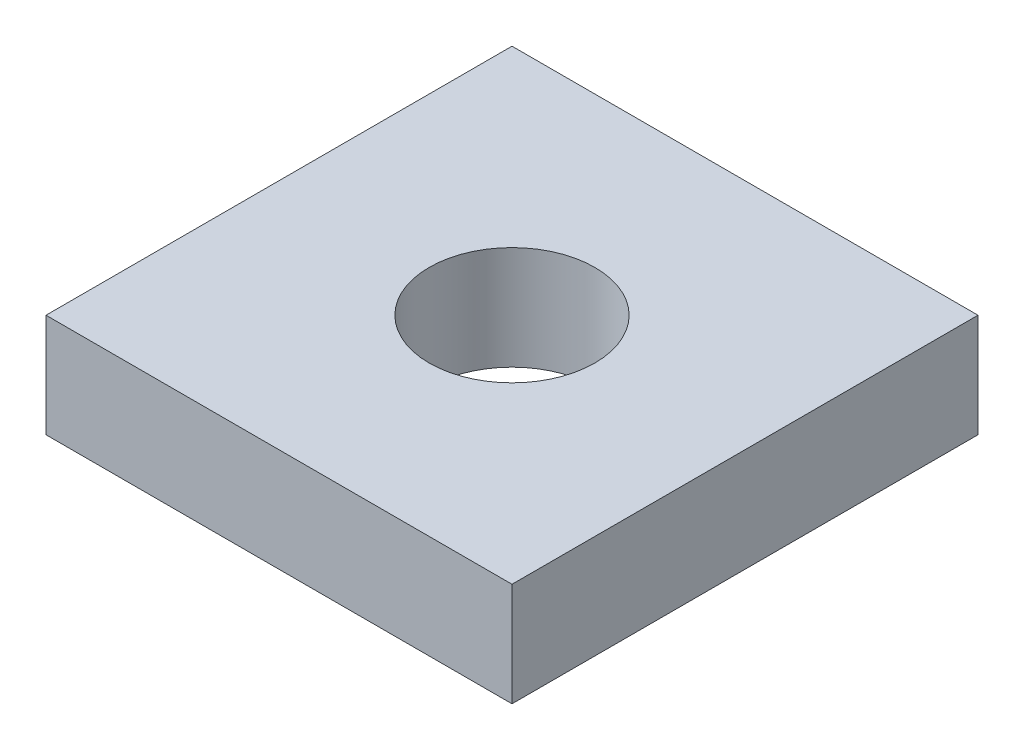
ISO-10303-21;
HEADER;
FILE_DESCRIPTION(('STEP AP214'),'2;1');
FILE_NAME('part.step','',(''),(''),'','','');
FILE_SCHEMA(('AUTOMOTIVE_DESIGN { 1 0 10303 214 1 1 1 1 }'));
ENDSEC;
DATA;
#1=APPLICATION_CONTEXT('core data for automotive mechanical design processes');
#2=APPLICATION_PROTOCOL_DEFINITION('international standard','automotive_design',2000,#1);
#3=PRODUCT_CONTEXT('',#1,'mechanical');
#4=PRODUCT('Part','Part','',(#3));
#5=PRODUCT_RELATED_PRODUCT_CATEGORY('part','',(#4));
#6=PRODUCT_DEFINITION_FORMATION('','',#4);
#7=PRODUCT_DEFINITION_CONTEXT('part definition',#1,'design');
#8=PRODUCT_DEFINITION('design','',#6,#7);
#9=PRODUCT_DEFINITION_SHAPE('','',#8);
#10=(LENGTH_UNIT() NAMED_UNIT(*) SI_UNIT(.MILLI.,.METRE.));
#11=(NAMED_UNIT(*) PLANE_ANGLE_UNIT() SI_UNIT($,.RADIAN.));
#12=(NAMED_UNIT(*) SI_UNIT($,.STERADIAN.) SOLID_ANGLE_UNIT());
#13=UNCERTAINTY_MEASURE_WITH_UNIT(LENGTH_MEASURE(1.E-05),#10,'distance_accuracy_value','');
#14=(GEOMETRIC_REPRESENTATION_CONTEXT(3) GLOBAL_UNCERTAINTY_ASSIGNED_CONTEXT((#13)) GLOBAL_UNIT_ASSIGNED_CONTEXT((#10,
#11,#12)) REPRESENTATION_CONTEXT('',''));
#15=CARTESIAN_POINT('',(0.,0.,0.));
#16=DIRECTION('',(0.,0.,1.));
#17=DIRECTION('',(1.,0.,0.));
#18=AXIS2_PLACEMENT_3D('',#15,#16,#17);
#19=CARTESIAN_POINT('',(0.,10.,0.));
#20=DIRECTION('',(0.,-1.,0.));
#21=DIRECTION('',(0.,0.,-1.));
#22=AXIS2_PLACEMENT_3D('',#19,#20,#21);
#23=PLANE('',#22);
#24=DIRECTION('',(0.,0.,1.));
#25=VECTOR('',#24,1.);
#26=CARTESIAN_POINT('',(0.,10.,0.));
#27=LINE('',#26,#25);
#28=CARTESIAN_POINT('',(0.,10.,-45.));
#29=VERTEX_POINT('',#28);
#30=CARTESIAN_POINT('',(0.,10.,0.));
#31=VERTEX_POINT('',#30);
#32=EDGE_CURVE('E84',#29,#31,#27,.T.);
#33=ORIENTED_EDGE('',*,*,#32,.T.);
#34=DIRECTION('',(1.,0.,0.));
#35=VECTOR('',#34,1.);
#36=CARTESIAN_POINT('',(0.,10.,0.));
#37=LINE('',#36,#35);
#38=CARTESIAN_POINT('',(45.,10.,0.));
#39=VERTEX_POINT('',#38);
#40=EDGE_CURVE('E79',#31,#39,#37,.T.);
#41=ORIENTED_EDGE('',*,*,#40,.T.);
#42=DIRECTION('',(0.,0.,-1.));
#43=VECTOR('',#42,1.);
#44=CARTESIAN_POINT('',(45.,10.,0.));
#45=LINE('',#44,#43);
#46=CARTESIAN_POINT('',(45.,10.,-45.));
#47=VERTEX_POINT('',#46);
#48=EDGE_CURVE('E82',#39,#47,#45,.T.);
#49=ORIENTED_EDGE('',*,*,#48,.T.);
#50=DIRECTION('',(-1.,0.,0.));
#51=VECTOR('',#50,1.);
#52=CARTESIAN_POINT('',(0.,10.,-45.));
#53=LINE('',#52,#51);
#54=EDGE_CURVE('E49',#47,#29,#53,.T.);
#55=ORIENTED_EDGE('',*,*,#54,.T.);
#56=EDGE_LOOP('',(#33,#41,#49,#55));
#57=FACE_BOUND('',#56,.T.);
#58=CARTESIAN_POINT('',(22.5,10.,-22.5));
#59=DIRECTION('',(0.,1.,0.));
#60=DIRECTION('',(0.,0.,1.));
#61=AXIS2_PLACEMENT_3D('',#58,#59,#60);
#62=CIRCLE('',#61,8.);
#63=CARTESIAN_POINT('',(22.5,10.,-14.5));
#64=VERTEX_POINT('',#63);
#65=EDGE_CURVE('E99',#64,#64,#62,.T.);
#66=ORIENTED_EDGE('',*,*,#65,.F.);
#67=EDGE_LOOP('',(#66));
#68=FACE_BOUND('',#67,.T.);
#69=ADVANCED_FACE('F32',(#57,#68),#23,.F.);
#70=CARTESIAN_POINT('',(0.,0.,0.));
#71=DIRECTION('',(0.,-1.,0.));
#72=DIRECTION('',(0.,0.,-1.));
#73=AXIS2_PLACEMENT_3D('',#70,#71,#72);
#74=PLANE('',#73);
#75=DIRECTION('',(0.,0.,1.));
#76=VECTOR('',#75,1.);
#77=CARTESIAN_POINT('',(0.,0.,0.));
#78=LINE('',#77,#76);
#79=CARTESIAN_POINT('',(0.,0.,-45.));
#80=VERTEX_POINT('',#79);
#81=CARTESIAN_POINT('',(0.,0.,0.));
#82=VERTEX_POINT('',#81);
#83=EDGE_CURVE('E96',#80,#82,#78,.T.);
#84=ORIENTED_EDGE('',*,*,#83,.F.);
#85=DIRECTION('',(-1.,0.,0.));
#86=VECTOR('',#85,1.);
#87=CARTESIAN_POINT('',(0.,0.,-45.));
#88=LINE('',#87,#86);
#89=CARTESIAN_POINT('',(45.,0.,-45.));
#90=VERTEX_POINT('',#89);
#91=EDGE_CURVE('E72',#90,#80,#88,.T.);
#92=ORIENTED_EDGE('',*,*,#91,.F.);
#93=DIRECTION('',(0.,0.,-1.));
#94=VECTOR('',#93,1.);
#95=CARTESIAN_POINT('',(45.,0.,0.));
#96=LINE('',#95,#94);
#97=CARTESIAN_POINT('',(45.,0.,0.));
#98=VERTEX_POINT('',#97);
#99=EDGE_CURVE('E66',#98,#90,#96,.T.);
#100=ORIENTED_EDGE('',*,*,#99,.F.);
#101=DIRECTION('',(1.,0.,0.));
#102=VECTOR('',#101,1.);
#103=CARTESIAN_POINT('',(0.,0.,0.));
#104=LINE('',#103,#102);
#105=EDGE_CURVE('E88',#82,#98,#104,.T.);
#106=ORIENTED_EDGE('',*,*,#105,.F.);
#107=EDGE_LOOP('',(#84,#92,#100,#106));
#108=FACE_BOUND('',#107,.T.);
#109=CARTESIAN_POINT('',(22.5,0.,-22.5));
#110=DIRECTION('',(0.,1.,0.));
#111=DIRECTION('',(0.,0.,1.));
#112=AXIS2_PLACEMENT_3D('',#109,#110,#111);
#113=CIRCLE('',#112,8.);
#114=CARTESIAN_POINT('',(22.5,0.,-14.5));
#115=VERTEX_POINT('',#114);
#116=EDGE_CURVE('E111',#115,#115,#113,.T.);
#117=ORIENTED_EDGE('',*,*,#116,.T.);
#118=EDGE_LOOP('',(#117));
#119=FACE_BOUND('',#118,.T.);
#120=ADVANCED_FACE('F107',(#108,#119),#74,.T.);
#121=CARTESIAN_POINT('',(0.,10.,0.));
#122=DIRECTION('',(1.,0.,0.));
#123=DIRECTION('',(0.,0.,-1.));
#124=AXIS2_PLACEMENT_3D('',#121,#122,#123);
#125=PLANE('',#124);
#126=ORIENTED_EDGE('',*,*,#83,.T.);
#127=DIRECTION('',(0.,-1.,0.));
#128=VECTOR('',#127,1.);
#129=CARTESIAN_POINT('',(0.,10.,0.));
#130=LINE('',#129,#128);
#131=EDGE_CURVE('E11',#31,#82,#130,.T.);
#132=ORIENTED_EDGE('',*,*,#131,.F.);
#133=ORIENTED_EDGE('',*,*,#32,.F.);
#134=DIRECTION('',(0.,-1.,0.));
#135=VECTOR('',#134,1.);
#136=CARTESIAN_POINT('',(0.,10.,-45.));
#137=LINE('',#136,#135);
#138=EDGE_CURVE('E92',#29,#80,#137,.T.);
#139=ORIENTED_EDGE('',*,*,#138,.T.);
#140=EDGE_LOOP('',(#126,#132,#133,#139));
#141=FACE_BOUND('',#140,.T.);
#142=ADVANCED_FACE('F34',(#141),#125,.F.);
#143=CARTESIAN_POINT('',(0.,10.,0.));
#144=DIRECTION('',(0.,0.,-1.));
#145=DIRECTION('',(-1.,0.,0.));
#146=AXIS2_PLACEMENT_3D('',#143,#144,#145);
#147=PLANE('',#146);
#148=ORIENTED_EDGE('',*,*,#105,.T.);
#149=DIRECTION('',(0.,-1.,0.));
#150=VECTOR('',#149,1.);
#151=CARTESIAN_POINT('',(45.,10.,0.));
#152=LINE('',#151,#150);
#153=EDGE_CURVE('E41',#39,#98,#152,.T.);
#154=ORIENTED_EDGE('',*,*,#153,.F.);
#155=ORIENTED_EDGE('',*,*,#40,.F.);
#156=ORIENTED_EDGE('',*,*,#131,.T.);
#157=EDGE_LOOP('',(#148,#154,#155,#156));
#158=FACE_BOUND('',#157,.T.);
#159=ADVANCED_FACE('F87',(#158),#147,.F.);
#160=CARTESIAN_POINT('',(45.,10.,0.));
#161=DIRECTION('',(-1.,0.,0.));
#162=DIRECTION('',(0.,0.,1.));
#163=AXIS2_PLACEMENT_3D('',#160,#161,#162);
#164=PLANE('',#163);
#165=ORIENTED_EDGE('',*,*,#99,.T.);
#166=DIRECTION('',(0.,-1.,0.));
#167=VECTOR('',#166,1.);
#168=CARTESIAN_POINT('',(45.,10.,-45.));
#169=LINE('',#168,#167);
#170=EDGE_CURVE('E89',#47,#90,#169,.T.);
#171=ORIENTED_EDGE('',*,*,#170,.F.);
#172=ORIENTED_EDGE('',*,*,#48,.F.);
#173=ORIENTED_EDGE('',*,*,#153,.T.);
#174=EDGE_LOOP('',(#165,#171,#172,#173));
#175=FACE_BOUND('',#174,.T.);
#176=ADVANCED_FACE('F90',(#175),#164,.F.);
#177=CARTESIAN_POINT('',(0.,10.,-45.));
#178=DIRECTION('',(0.,0.,1.));
#179=DIRECTION('',(1.,0.,0.));
#180=AXIS2_PLACEMENT_3D('',#177,#178,#179);
#181=PLANE('',#180);
#182=ORIENTED_EDGE('',*,*,#91,.T.);
#183=ORIENTED_EDGE('',*,*,#138,.F.);
#184=ORIENTED_EDGE('',*,*,#54,.F.);
#185=ORIENTED_EDGE('',*,*,#170,.T.);
#186=EDGE_LOOP('',(#182,#183,#184,#185));
#187=FACE_BOUND('',#186,.T.);
#188=ADVANCED_FACE('F104',(#187),#181,.F.);
#189=CARTESIAN_POINT('',(22.5,10.,-22.5));
#190=DIRECTION('',(0.,-1.,0.));
#191=DIRECTION('',(0.,0.,-1.));
#192=AXIS2_PLACEMENT_3D('',#189,#190,#191);
#193=CYLINDRICAL_SURFACE('',#192,8.);
#194=ORIENTED_EDGE('',*,*,#65,.T.);
#195=EDGE_LOOP('',(#194));
#196=FACE_BOUND('',#195,.T.);
#197=ORIENTED_EDGE('',*,*,#116,.F.);
#198=EDGE_LOOP('',(#197));
#199=FACE_BOUND('',#198,.T.);
#200=ADVANCED_FACE('F117',(#196,#199),#193,.F.);
#201=CLOSED_SHELL('',(#69,#120,#142,#159,#176,#188,#200));
#202=MANIFOLD_SOLID_BREP('B2',#201);
#203=ADVANCED_BREP_SHAPE_REPRESENTATION('',(#18,#202),#14);
#204=SHAPE_DEFINITION_REPRESENTATION(#9,#203);
ENDSEC;
END-ISO-10303-21;
